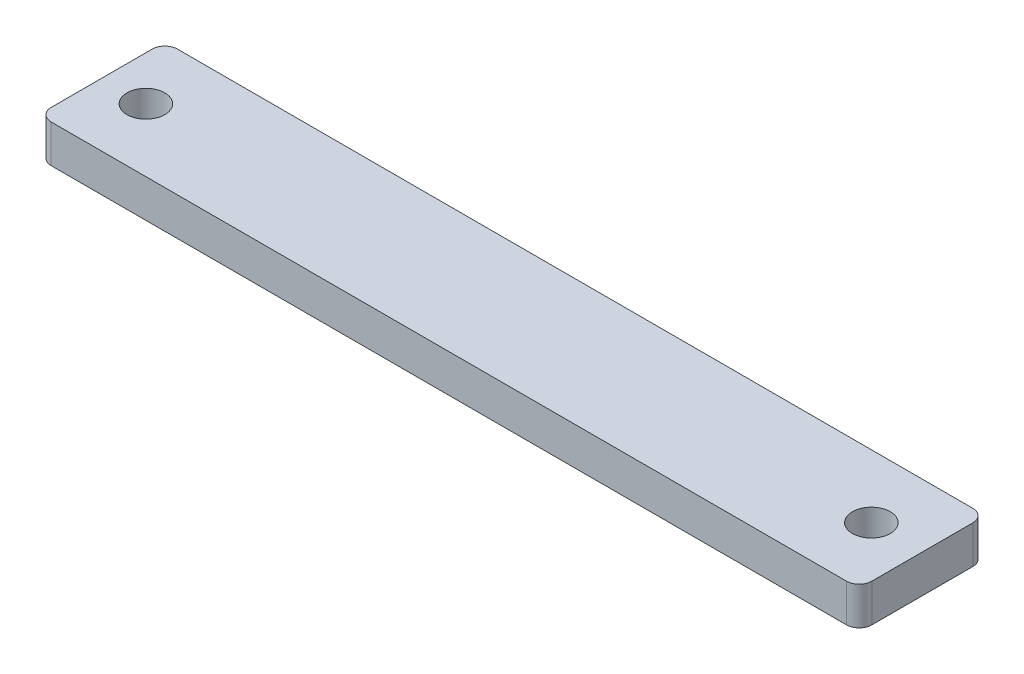
ISO-10303-21;
HEADER;
FILE_DESCRIPTION(('STEP AP214'),'2;1');
FILE_NAME('part.step','',(''),(''),'','','');
FILE_SCHEMA(('AUTOMOTIVE_DESIGN { 1 0 10303 214 1 1 1 1 }'));
ENDSEC;
DATA;
#1=APPLICATION_CONTEXT('core data for automotive mechanical design processes');
#2=APPLICATION_PROTOCOL_DEFINITION('international standard','automotive_design',2000,#1);
#3=PRODUCT_CONTEXT('',#1,'mechanical');
#4=PRODUCT('Part','Part','',(#3));
#5=PRODUCT_RELATED_PRODUCT_CATEGORY('part','',(#4));
#6=PRODUCT_DEFINITION_FORMATION('','',#4);
#7=PRODUCT_DEFINITION_CONTEXT('part definition',#1,'design');
#8=PRODUCT_DEFINITION('design','',#6,#7);
#9=PRODUCT_DEFINITION_SHAPE('','',#8);
#10=(LENGTH_UNIT() NAMED_UNIT(*) SI_UNIT(.MILLI.,.METRE.));
#11=(NAMED_UNIT(*) PLANE_ANGLE_UNIT() SI_UNIT($,.RADIAN.));
#12=(NAMED_UNIT(*) SI_UNIT($,.STERADIAN.) SOLID_ANGLE_UNIT());
#13=UNCERTAINTY_MEASURE_WITH_UNIT(LENGTH_MEASURE(1.E-05),#10,'distance_accuracy_value','');
#14=(GEOMETRIC_REPRESENTATION_CONTEXT(3) GLOBAL_UNCERTAINTY_ASSIGNED_CONTEXT((#13)) GLOBAL_UNIT_ASSIGNED_CONTEXT((#10,
#11,#12)) REPRESENTATION_CONTEXT('',''));
#15=CARTESIAN_POINT('',(0.,0.,0.));
#16=DIRECTION('',(0.,0.,1.));
#17=DIRECTION('',(1.,0.,0.));
#18=AXIS2_PLACEMENT_3D('',#15,#16,#17);
#19=CARTESIAN_POINT('',(0.,3.,0.));
#20=DIRECTION('',(0.,1.,0.));
#21=DIRECTION('',(0.,0.,1.));
#22=AXIS2_PLACEMENT_3D('',#19,#20,#21);
#23=PLANE('',#22);
#24=CARTESIAN_POINT('',(-28.7323907064959,3.,-1.07043717401611));
#25=DIRECTION('',(0.,1.,0.));
#26=DIRECTION('',(0.,0.,1.));
#27=AXIS2_PLACEMENT_3D('',#24,#25,#26);
#28=CIRCLE('',#27,1.5);
#29=CARTESIAN_POINT('',(-28.7323907064959,3.,0.429562825983886));
#30=VERTEX_POINT('',#29);
#31=EDGE_CURVE('E178',#30,#30,#28,.T.);
#32=ORIENTED_EDGE('',*,*,#31,.F.);
#33=EDGE_LOOP('',(#32));
#34=FACE_BOUND('',#33,.T.);
#35=DIRECTION('',(-1.,0.,0.));
#36=VECTOR('',#35,1.);
#37=CARTESIAN_POINT('',(-32.2323907064959,3.,-6.07043717401611));
#38=LINE('',#37,#36);
#39=CARTESIAN_POINT('',(31.7676092935041,3.,-6.07043717401611));
#40=VERTEX_POINT('',#39);
#41=CARTESIAN_POINT('',(-31.2323907064959,3.,-6.07043717401611));
#42=VERTEX_POINT('',#41);
#43=EDGE_CURVE('E169',#40,#42,#38,.T.);
#44=ORIENTED_EDGE('',*,*,#43,.T.);
#45=CARTESIAN_POINT('',(-31.2323907064959,3.,-5.07043717401611));
#46=DIRECTION('',(0.,1.,0.));
#47=DIRECTION('',(0.,0.,1.));
#48=AXIS2_PLACEMENT_3D('',#45,#46,#47);
#49=CIRCLE('',#48,1.);
#50=CARTESIAN_POINT('',(-32.2323907064959,3.,-5.07043717401611));
#51=VERTEX_POINT('',#50);
#52=EDGE_CURVE('E147',#42,#51,#49,.T.);
#53=ORIENTED_EDGE('',*,*,#52,.T.);
#54=DIRECTION('',(0.,0.,1.));
#55=VECTOR('',#54,1.);
#56=CARTESIAN_POINT('',(-32.2323907064959,3.,-6.07043717401611));
#57=LINE('',#56,#55);
#58=CARTESIAN_POINT('',(-32.2323907064959,3.,2.92956282598389));
#59=VERTEX_POINT('',#58);
#60=EDGE_CURVE('E117',#51,#59,#57,.T.);
#61=ORIENTED_EDGE('',*,*,#60,.T.);
#62=CARTESIAN_POINT('',(-31.2323907064959,3.,2.92956282598389));
#63=DIRECTION('',(0.,1.,0.));
#64=DIRECTION('',(0.,0.,1.));
#65=AXIS2_PLACEMENT_3D('',#62,#63,#64);
#66=CIRCLE('',#65,1.);
#67=CARTESIAN_POINT('',(-31.2323907064959,3.,3.92956282598389));
#68=VERTEX_POINT('',#67);
#69=EDGE_CURVE('E53',#59,#68,#66,.T.);
#70=ORIENTED_EDGE('',*,*,#69,.T.);
#71=DIRECTION('',(1.,0.,0.));
#72=VECTOR('',#71,1.);
#73=CARTESIAN_POINT('',(-32.2323907064959,3.,3.92956282598389));
#74=LINE('',#73,#72);
#75=CARTESIAN_POINT('',(31.7676092935041,3.,3.92956282598389));
#76=VERTEX_POINT('',#75);
#77=EDGE_CURVE('E133',#68,#76,#74,.T.);
#78=ORIENTED_EDGE('',*,*,#77,.T.);
#79=CARTESIAN_POINT('',(31.7676092935041,3.,2.92956282598389));
#80=DIRECTION('',(0.,1.,0.));
#81=DIRECTION('',(0.,0.,1.));
#82=AXIS2_PLACEMENT_3D('',#79,#80,#81);
#83=CIRCLE('',#82,1.);
#84=CARTESIAN_POINT('',(32.7676092935041,3.,2.92956282598389));
#85=VERTEX_POINT('',#84);
#86=EDGE_CURVE('E143',#76,#85,#83,.T.);
#87=ORIENTED_EDGE('',*,*,#86,.T.);
#88=DIRECTION('',(0.,0.,-1.));
#89=VECTOR('',#88,1.);
#90=CARTESIAN_POINT('',(32.7676092935041,3.,-6.07043717401611));
#91=LINE('',#90,#89);
#92=CARTESIAN_POINT('',(32.7676092935041,3.,-5.07043717401611));
#93=VERTEX_POINT('',#92);
#94=EDGE_CURVE('E127',#85,#93,#91,.T.);
#95=ORIENTED_EDGE('',*,*,#94,.T.);
#96=CARTESIAN_POINT('',(31.7676092935041,3.,-5.07043717401611));
#97=DIRECTION('',(0.,1.,0.));
#98=DIRECTION('',(0.,0.,1.));
#99=AXIS2_PLACEMENT_3D('',#96,#97,#98);
#100=CIRCLE('',#99,1.);
#101=EDGE_CURVE('E145',#93,#40,#100,.T.);
#102=ORIENTED_EDGE('',*,*,#101,.T.);
#103=EDGE_LOOP('',(#44,#53,#61,#70,#78,#87,#95,#102));
#104=FACE_BOUND('',#103,.T.);
#105=CARTESIAN_POINT('',(28.7323907064959,3.,-1.07043717401611));
#106=DIRECTION('',(0.,1.,0.));
#107=DIRECTION('',(0.,0.,-1.));
#108=AXIS2_PLACEMENT_3D('',#105,#106,#107);
#109=CIRCLE('',#108,1.5);
#110=CARTESIAN_POINT('',(28.7323907064959,3.,-2.57043717401611));
#111=VERTEX_POINT('',#110);
#112=EDGE_CURVE('E183',#111,#111,#109,.T.);
#113=ORIENTED_EDGE('',*,*,#112,.F.);
#114=EDGE_LOOP('',(#113));
#115=FACE_BOUND('',#114,.T.);
#116=ADVANCED_FACE('F33',(#34,#104,#115),#23,.T.);
#117=CARTESIAN_POINT('',(0.,0.,0.));
#118=DIRECTION('',(0.,1.,0.));
#119=DIRECTION('',(0.,0.,1.));
#120=AXIS2_PLACEMENT_3D('',#117,#118,#119);
#121=PLANE('',#120);
#122=DIRECTION('',(0.,0.,1.));
#123=VECTOR('',#122,1.);
#124=CARTESIAN_POINT('',(-32.2323907064959,0.,-6.07043717401611));
#125=LINE('',#124,#123);
#126=CARTESIAN_POINT('',(-32.2323907064959,0.,-5.07043717401611));
#127=VERTEX_POINT('',#126);
#128=CARTESIAN_POINT('',(-32.2323907064959,0.,2.92956282598389));
#129=VERTEX_POINT('',#128);
#130=EDGE_CURVE('E115',#127,#129,#125,.T.);
#131=ORIENTED_EDGE('',*,*,#130,.F.);
#132=CARTESIAN_POINT('',(-31.2323907064959,0.,-5.07043717401611));
#133=DIRECTION('',(0.,1.,0.));
#134=DIRECTION('',(0.,0.,1.));
#135=AXIS2_PLACEMENT_3D('',#132,#133,#134);
#136=CIRCLE('',#135,1.);
#137=CARTESIAN_POINT('',(-31.2323907064959,0.,-6.07043717401611));
#138=VERTEX_POINT('',#137);
#139=EDGE_CURVE('E98',#127,#138,#136,.F.);
#140=ORIENTED_EDGE('',*,*,#139,.T.);
#141=DIRECTION('',(-1.,0.,0.));
#142=VECTOR('',#141,1.);
#143=CARTESIAN_POINT('',(-32.2323907064959,0.,-6.07043717401611));
#144=LINE('',#143,#142);
#145=CARTESIAN_POINT('',(31.7676092935041,0.,-6.07043717401611));
#146=VERTEX_POINT('',#145);
#147=EDGE_CURVE('E125',#146,#138,#144,.T.);
#148=ORIENTED_EDGE('',*,*,#147,.F.);
#149=CARTESIAN_POINT('',(31.7676092935041,0.,-5.07043717401611));
#150=DIRECTION('',(0.,1.,0.));
#151=DIRECTION('',(0.,0.,1.));
#152=AXIS2_PLACEMENT_3D('',#149,#150,#151);
#153=CIRCLE('',#152,1.);
#154=CARTESIAN_POINT('',(32.7676092935041,0.,-5.07043717401611));
#155=VERTEX_POINT('',#154);
#156=EDGE_CURVE('E109',#146,#155,#153,.F.);
#157=ORIENTED_EDGE('',*,*,#156,.T.);
#158=DIRECTION('',(0.,0.,-1.));
#159=VECTOR('',#158,1.);
#160=CARTESIAN_POINT('',(32.7676092935041,0.,-6.07043717401611));
#161=LINE('',#160,#159);
#162=CARTESIAN_POINT('',(32.7676092935041,0.,2.92956282598389));
#163=VERTEX_POINT('',#162);
#164=EDGE_CURVE('E129',#163,#155,#161,.T.);
#165=ORIENTED_EDGE('',*,*,#164,.F.);
#166=CARTESIAN_POINT('',(31.7676092935041,0.,2.92956282598389));
#167=DIRECTION('',(0.,1.,0.));
#168=DIRECTION('',(0.,0.,1.));
#169=AXIS2_PLACEMENT_3D('',#166,#167,#168);
#170=CIRCLE('',#169,1.);
#171=CARTESIAN_POINT('',(31.7676092935041,0.,3.92956282598389));
#172=VERTEX_POINT('',#171);
#173=EDGE_CURVE('E136',#163,#172,#170,.F.);
#174=ORIENTED_EDGE('',*,*,#173,.T.);
#175=DIRECTION('',(1.,0.,0.));
#176=VECTOR('',#175,1.);
#177=CARTESIAN_POINT('',(-32.2323907064959,0.,3.92956282598389));
#178=LINE('',#177,#176);
#179=CARTESIAN_POINT('',(-31.2323907064959,0.,3.92956282598389));
#180=VERTEX_POINT('',#179);
#181=EDGE_CURVE('E124',#180,#172,#178,.T.);
#182=ORIENTED_EDGE('',*,*,#181,.F.);
#183=CARTESIAN_POINT('',(-31.2323907064959,0.,2.92956282598389));
#184=DIRECTION('',(0.,1.,0.));
#185=DIRECTION('',(0.,0.,1.));
#186=AXIS2_PLACEMENT_3D('',#183,#184,#185);
#187=CIRCLE('',#186,1.);
#188=EDGE_CURVE('E118',#180,#129,#187,.F.);
#189=ORIENTED_EDGE('',*,*,#188,.T.);
#190=EDGE_LOOP('',(#131,#140,#148,#157,#165,#174,#182,#189));
#191=FACE_BOUND('',#190,.T.);
#192=CARTESIAN_POINT('',(-28.7323907064959,0.,-1.07043717401611));
#193=DIRECTION('',(0.,1.,0.));
#194=DIRECTION('',(0.,0.,1.));
#195=AXIS2_PLACEMENT_3D('',#192,#193,#194);
#196=CIRCLE('',#195,1.5);
#197=CARTESIAN_POINT('',(-28.7323907064959,0.,0.429562825983886));
#198=VERTEX_POINT('',#197);
#199=EDGE_CURVE('E174',#198,#198,#196,.T.);
#200=ORIENTED_EDGE('',*,*,#199,.T.);
#201=EDGE_LOOP('',(#200));
#202=FACE_BOUND('',#201,.T.);
#203=CARTESIAN_POINT('',(28.7323907064959,0.,-1.07043717401611));
#204=DIRECTION('',(0.,1.,0.));
#205=DIRECTION('',(0.,0.,-1.));
#206=AXIS2_PLACEMENT_3D('',#203,#204,#205);
#207=CIRCLE('',#206,1.5);
#208=CARTESIAN_POINT('',(28.7323907064959,0.,-2.57043717401611));
#209=VERTEX_POINT('',#208);
#210=EDGE_CURVE('E185',#209,#209,#207,.T.);
#211=ORIENTED_EDGE('',*,*,#210,.T.);
#212=EDGE_LOOP('',(#211));
#213=FACE_BOUND('',#212,.T.);
#214=ADVANCED_FACE('F121',(#191,#202,#213),#121,.F.);
#215=CARTESIAN_POINT('',(32.7676092935041,3.,-6.07043717401611));
#216=DIRECTION('',(-1.,0.,0.));
#217=DIRECTION('',(0.,0.,1.));
#218=AXIS2_PLACEMENT_3D('',#215,#216,#217);
#219=PLANE('',#218);
#220=ORIENTED_EDGE('',*,*,#164,.T.);
#221=DIRECTION('',(0.,-1.,0.));
#222=VECTOR('',#221,1.);
#223=CARTESIAN_POINT('',(32.7676092935041,3.,-5.07043717401611));
#224=LINE('',#223,#222);
#225=EDGE_CURVE('E152',#155,#93,#224,.F.);
#226=ORIENTED_EDGE('',*,*,#225,.T.);
#227=ORIENTED_EDGE('',*,*,#94,.F.);
#228=DIRECTION('',(0.,-1.,0.));
#229=VECTOR('',#228,1.);
#230=CARTESIAN_POINT('',(32.7676092935041,3.,2.92956282598389));
#231=LINE('',#230,#229);
#232=EDGE_CURVE('E149',#85,#163,#231,.T.);
#233=ORIENTED_EDGE('',*,*,#232,.T.);
#234=EDGE_LOOP('',(#220,#226,#227,#233));
#235=FACE_BOUND('',#234,.T.);
#236=ADVANCED_FACE('F165',(#235),#219,.F.);
#237=CARTESIAN_POINT('',(-32.2323907064959,3.,-6.07043717401611));
#238=DIRECTION('',(0.,0.,1.));
#239=DIRECTION('',(1.,0.,0.));
#240=AXIS2_PLACEMENT_3D('',#237,#238,#239);
#241=PLANE('',#240);
#242=ORIENTED_EDGE('',*,*,#147,.T.);
#243=DIRECTION('',(0.,-1.,0.));
#244=VECTOR('',#243,1.);
#245=CARTESIAN_POINT('',(-31.2323907064959,3.,-6.07043717401611));
#246=LINE('',#245,#244);
#247=EDGE_CURVE('E103',#138,#42,#246,.F.);
#248=ORIENTED_EDGE('',*,*,#247,.T.);
#249=ORIENTED_EDGE('',*,*,#43,.F.);
#250=DIRECTION('',(0.,-1.,0.));
#251=VECTOR('',#250,1.);
#252=CARTESIAN_POINT('',(31.7676092935041,3.,-6.07043717401611));
#253=LINE('',#252,#251);
#254=EDGE_CURVE('E108',#40,#146,#253,.T.);
#255=ORIENTED_EDGE('',*,*,#254,.T.);
#256=EDGE_LOOP('',(#242,#248,#249,#255));
#257=FACE_BOUND('',#256,.T.);
#258=ADVANCED_FACE('F209',(#257),#241,.F.);
#259=CARTESIAN_POINT('',(-32.2323907064959,3.,-6.07043717401611));
#260=DIRECTION('',(1.,0.,0.));
#261=DIRECTION('',(0.,0.,-1.));
#262=AXIS2_PLACEMENT_3D('',#259,#260,#261);
#263=PLANE('',#262);
#264=ORIENTED_EDGE('',*,*,#60,.F.);
#265=DIRECTION('',(0.,-1.,0.));
#266=VECTOR('',#265,1.);
#267=CARTESIAN_POINT('',(-32.2323907064959,3.,-5.07043717401611));
#268=LINE('',#267,#266);
#269=EDGE_CURVE('E102',#51,#127,#268,.T.);
#270=ORIENTED_EDGE('',*,*,#269,.T.);
#271=ORIENTED_EDGE('',*,*,#130,.T.);
#272=DIRECTION('',(0.,-1.,0.));
#273=VECTOR('',#272,1.);
#274=CARTESIAN_POINT('',(-32.2323907064959,3.,2.92956282598389));
#275=LINE('',#274,#273);
#276=EDGE_CURVE('E119',#129,#59,#275,.F.);
#277=ORIENTED_EDGE('',*,*,#276,.T.);
#278=EDGE_LOOP('',(#264,#270,#271,#277));
#279=FACE_BOUND('',#278,.T.);
#280=ADVANCED_FACE('F114',(#279),#263,.F.);
#281=CARTESIAN_POINT('',(-32.2323907064959,3.,3.92956282598389));
#282=DIRECTION('',(0.,0.,-1.));
#283=DIRECTION('',(-1.,0.,0.));
#284=AXIS2_PLACEMENT_3D('',#281,#282,#283);
#285=PLANE('',#284);
#286=ORIENTED_EDGE('',*,*,#181,.T.);
#287=DIRECTION('',(0.,-1.,0.));
#288=VECTOR('',#287,1.);
#289=CARTESIAN_POINT('',(31.7676092935041,3.,3.92956282598389));
#290=LINE('',#289,#288);
#291=EDGE_CURVE('E11',#172,#76,#290,.F.);
#292=ORIENTED_EDGE('',*,*,#291,.T.);
#293=ORIENTED_EDGE('',*,*,#77,.F.);
#294=DIRECTION('',(0.,-1.,0.));
#295=VECTOR('',#294,1.);
#296=CARTESIAN_POINT('',(-31.2323907064959,3.,3.92956282598389));
#297=LINE('',#296,#295);
#298=EDGE_CURVE('E41',#68,#180,#297,.T.);
#299=ORIENTED_EDGE('',*,*,#298,.T.);
#300=EDGE_LOOP('',(#286,#292,#293,#299));
#301=FACE_BOUND('',#300,.T.);
#302=ADVANCED_FACE('F155',(#301),#285,.F.);
#303=CARTESIAN_POINT('',(-28.7323907064959,3.,-1.07043717401611));
#304=DIRECTION('',(0.,-1.,0.));
#305=DIRECTION('',(0.,0.,-1.));
#306=AXIS2_PLACEMENT_3D('',#303,#304,#305);
#307=CYLINDRICAL_SURFACE('',#306,1.5);
#308=ORIENTED_EDGE('',*,*,#31,.T.);
#309=EDGE_LOOP('',(#308));
#310=FACE_BOUND('',#309,.T.);
#311=ORIENTED_EDGE('',*,*,#199,.F.);
#312=EDGE_LOOP('',(#311));
#313=FACE_BOUND('',#312,.T.);
#314=ADVANCED_FACE('F202',(#310,#313),#307,.F.);
#315=CARTESIAN_POINT('',(28.7323907064959,3.,-1.07043717401611));
#316=DIRECTION('',(0.,-1.,0.));
#317=DIRECTION('',(0.,0.,-1.));
#318=AXIS2_PLACEMENT_3D('',#315,#316,#317);
#319=CYLINDRICAL_SURFACE('',#318,1.5);
#320=ORIENTED_EDGE('',*,*,#112,.T.);
#321=EDGE_LOOP('',(#320));
#322=FACE_BOUND('',#321,.T.);
#323=ORIENTED_EDGE('',*,*,#210,.F.);
#324=EDGE_LOOP('',(#323));
#325=FACE_BOUND('',#324,.T.);
#326=ADVANCED_FACE('F191',(#322,#325),#319,.F.);
#327=CARTESIAN_POINT('',(-31.2323907064959,3.,-5.07043717401611));
#328=DIRECTION('',(0.,-1.,0.));
#329=DIRECTION('',(0.,0.,-1.));
#330=AXIS2_PLACEMENT_3D('',#327,#328,#329);
#331=CYLINDRICAL_SURFACE('',#330,1.);
#332=ORIENTED_EDGE('',*,*,#52,.F.);
#333=ORIENTED_EDGE('',*,*,#247,.F.);
#334=ORIENTED_EDGE('',*,*,#139,.F.);
#335=ORIENTED_EDGE('',*,*,#269,.F.);
#336=EDGE_LOOP('',(#332,#333,#334,#335));
#337=FACE_BOUND('',#336,.T.);
#338=ADVANCED_FACE('F101',(#337),#331,.T.);
#339=CARTESIAN_POINT('',(31.7676092935041,3.,-5.07043717401611));
#340=DIRECTION('',(0.,-1.,0.));
#341=DIRECTION('',(0.,0.,-1.));
#342=AXIS2_PLACEMENT_3D('',#339,#340,#341);
#343=CYLINDRICAL_SURFACE('',#342,1.);
#344=ORIENTED_EDGE('',*,*,#101,.F.);
#345=ORIENTED_EDGE('',*,*,#225,.F.);
#346=ORIENTED_EDGE('',*,*,#156,.F.);
#347=ORIENTED_EDGE('',*,*,#254,.F.);
#348=EDGE_LOOP('',(#344,#345,#346,#347));
#349=FACE_BOUND('',#348,.T.);
#350=ADVANCED_FACE('F217',(#349),#343,.T.);
#351=CARTESIAN_POINT('',(31.7676092935041,3.,2.92956282598389));
#352=DIRECTION('',(0.,-1.,0.));
#353=DIRECTION('',(0.,0.,-1.));
#354=AXIS2_PLACEMENT_3D('',#351,#352,#353);
#355=CYLINDRICAL_SURFACE('',#354,1.);
#356=ORIENTED_EDGE('',*,*,#86,.F.);
#357=ORIENTED_EDGE('',*,*,#291,.F.);
#358=ORIENTED_EDGE('',*,*,#173,.F.);
#359=ORIENTED_EDGE('',*,*,#232,.F.);
#360=EDGE_LOOP('',(#356,#357,#358,#359));
#361=FACE_BOUND('',#360,.T.);
#362=ADVANCED_FACE('F162',(#361),#355,.T.);
#363=CARTESIAN_POINT('',(-31.2323907064959,3.,2.92956282598389));
#364=DIRECTION('',(0.,-1.,0.));
#365=DIRECTION('',(0.,0.,-1.));
#366=AXIS2_PLACEMENT_3D('',#363,#364,#365);
#367=CYLINDRICAL_SURFACE('',#366,1.);
#368=ORIENTED_EDGE('',*,*,#69,.F.);
#369=ORIENTED_EDGE('',*,*,#276,.F.);
#370=ORIENTED_EDGE('',*,*,#188,.F.);
#371=ORIENTED_EDGE('',*,*,#298,.F.);
#372=EDGE_LOOP('',(#368,#369,#370,#371));
#373=FACE_BOUND('',#372,.T.);
#374=ADVANCED_FACE('F35',(#373),#367,.T.);
#375=CLOSED_SHELL('',(#116,#214,#236,#258,#280,#302,#314,#326,#338,#350,#362,#374));
#376=MANIFOLD_SOLID_BREP('B2',#375);
#377=ADVANCED_BREP_SHAPE_REPRESENTATION('',(#18,#376),#14);
#378=SHAPE_DEFINITION_REPRESENTATION(#9,#377);
ENDSEC;
END-ISO-10303-21;
